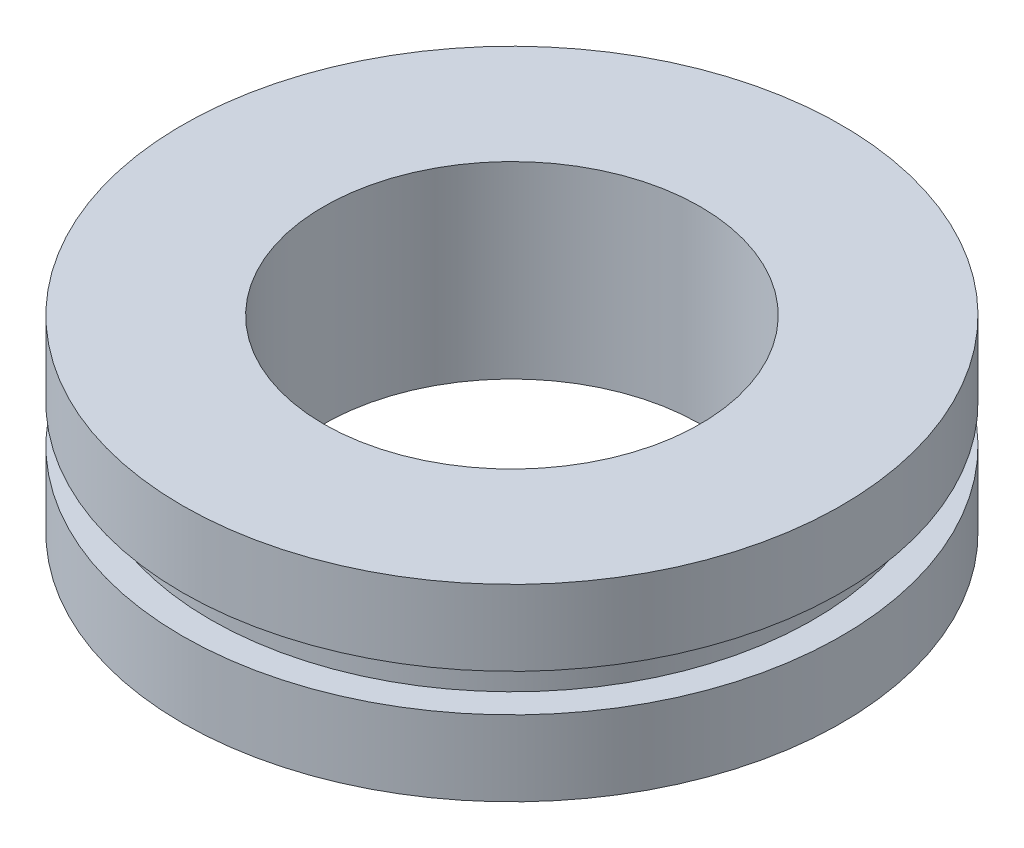
ISO-10303-21;
HEADER;
FILE_DESCRIPTION(('STEP AP214'),'2;1');
FILE_NAME('part.step','',(''),(''),'','','');
FILE_SCHEMA(('AUTOMOTIVE_DESIGN { 1 0 10303 214 1 1 1 1 }'));
ENDSEC;
DATA;
#1=APPLICATION_CONTEXT('core data for automotive mechanical design processes');
#2=APPLICATION_PROTOCOL_DEFINITION('international standard','automotive_design',2000,#1);
#3=PRODUCT_CONTEXT('',#1,'mechanical');
#4=PRODUCT('Part','Part','',(#3));
#5=PRODUCT_RELATED_PRODUCT_CATEGORY('part','',(#4));
#6=PRODUCT_DEFINITION_FORMATION('','',#4);
#7=PRODUCT_DEFINITION_CONTEXT('part definition',#1,'design');
#8=PRODUCT_DEFINITION('design','',#6,#7);
#9=PRODUCT_DEFINITION_SHAPE('','',#8);
#10=(LENGTH_UNIT() NAMED_UNIT(*) SI_UNIT(.MILLI.,.METRE.));
#11=(NAMED_UNIT(*) PLANE_ANGLE_UNIT() SI_UNIT($,.RADIAN.));
#12=(NAMED_UNIT(*) SI_UNIT($,.STERADIAN.) SOLID_ANGLE_UNIT());
#13=UNCERTAINTY_MEASURE_WITH_UNIT(LENGTH_MEASURE(1.E-05),#10,'distance_accuracy_value','');
#14=(GEOMETRIC_REPRESENTATION_CONTEXT(3) GLOBAL_UNCERTAINTY_ASSIGNED_CONTEXT((#13)) GLOBAL_UNIT_ASSIGNED_CONTEXT((#10,
#11,#12)) REPRESENTATION_CONTEXT('',''));
#15=CARTESIAN_POINT('',(0.,0.,0.));
#16=DIRECTION('',(0.,0.,1.));
#17=DIRECTION('',(1.,0.,0.));
#18=AXIS2_PLACEMENT_3D('',#15,#16,#17);
#19=CARTESIAN_POINT('',(0.,10.,0.));
#20=DIRECTION('',(0.,-1.,0.));
#21=DIRECTION('',(0.,0.,-1.));
#22=AXIS2_PLACEMENT_3D('',#19,#20,#21);
#23=CYLINDRICAL_SURFACE('',#22,17.5);
#24=CARTESIAN_POINT('',(0.,0.,0.));
#25=DIRECTION('',(0.,1.,0.));
#26=DIRECTION('',(0.,0.,1.));
#27=AXIS2_PLACEMENT_3D('',#24,#25,#26);
#28=CIRCLE('',#27,17.5);
#29=CARTESIAN_POINT('',(0.,0.,17.5));
#30=VERTEX_POINT('',#29);
#31=EDGE_CURVE('E43',#30,#30,#28,.T.);
#32=ORIENTED_EDGE('',*,*,#31,.T.);
#33=EDGE_LOOP('',(#32));
#34=FACE_BOUND('',#33,.T.);
#35=CARTESIAN_POINT('',(0.,4.,0.));
#36=DIRECTION('',(0.,1.,0.));
#37=DIRECTION('',(0.,0.,1.));
#38=AXIS2_PLACEMENT_3D('',#35,#36,#37);
#39=CIRCLE('',#38,17.5);
#40=CARTESIAN_POINT('',(0.,4.,17.5));
#41=VERTEX_POINT('',#40);
#42=EDGE_CURVE('E55',#41,#41,#39,.T.);
#43=ORIENTED_EDGE('',*,*,#42,.F.);
#44=EDGE_LOOP('',(#43));
#45=FACE_BOUND('',#44,.T.);
#46=ADVANCED_FACE('F39',(#34,#45),#23,.T.);
#47=CARTESIAN_POINT('',(0.,10.,0.));
#48=DIRECTION('',(0.,1.,0.));
#49=DIRECTION('',(0.,0.,1.));
#50=AXIS2_PLACEMENT_3D('',#47,#48,#49);
#51=PLANE('',#50);
#52=CARTESIAN_POINT('',(0.,10.,0.));
#53=DIRECTION('',(0.,1.,0.));
#54=DIRECTION('',(0.,0.,1.));
#55=AXIS2_PLACEMENT_3D('',#52,#53,#54);
#56=CIRCLE('',#55,17.5);
#57=CARTESIAN_POINT('',(0.,10.,17.5));
#58=VERTEX_POINT('',#57);
#59=EDGE_CURVE('E10',#58,#58,#56,.T.);
#60=ORIENTED_EDGE('',*,*,#59,.T.);
#61=EDGE_LOOP('',(#60));
#62=FACE_BOUND('',#61,.T.);
#63=CARTESIAN_POINT('',(0.,10.,0.));
#64=DIRECTION('',(0.,1.,0.));
#65=DIRECTION('',(0.,0.,1.));
#66=AXIS2_PLACEMENT_3D('',#63,#64,#65);
#67=CIRCLE('',#66,10.);
#68=CARTESIAN_POINT('',(0.,10.,10.));
#69=VERTEX_POINT('',#68);
#70=EDGE_CURVE('E50',#69,#69,#67,.T.);
#71=ORIENTED_EDGE('',*,*,#70,.F.);
#72=EDGE_LOOP('',(#71));
#73=FACE_BOUND('',#72,.T.);
#74=ADVANCED_FACE('F82',(#62,#73),#51,.T.);
#75=CARTESIAN_POINT('',(0.,0.,0.));
#76=DIRECTION('',(0.,1.,0.));
#77=DIRECTION('',(0.,0.,1.));
#78=AXIS2_PLACEMENT_3D('',#75,#76,#77);
#79=PLANE('',#78);
#80=ORIENTED_EDGE('',*,*,#31,.F.);
#81=EDGE_LOOP('',(#80));
#82=FACE_BOUND('',#81,.T.);
#83=CARTESIAN_POINT('',(0.,0.,0.));
#84=DIRECTION('',(0.,1.,0.));
#85=DIRECTION('',(0.,0.,1.));
#86=AXIS2_PLACEMENT_3D('',#83,#84,#85);
#87=CIRCLE('',#86,10.);
#88=CARTESIAN_POINT('',(0.,0.,10.));
#89=VERTEX_POINT('',#88);
#90=EDGE_CURVE('E52',#89,#89,#87,.T.);
#91=ORIENTED_EDGE('',*,*,#90,.T.);
#92=EDGE_LOOP('',(#91));
#93=FACE_BOUND('',#92,.T.);
#94=ADVANCED_FACE('F89',(#82,#93),#79,.F.);
#95=CARTESIAN_POINT('',(0.,6.,0.));
#96=DIRECTION('',(0.,1.,0.));
#97=DIRECTION('',(0.,0.,1.));
#98=AXIS2_PLACEMENT_3D('',#95,#96,#97);
#99=CIRCLE('',#98,17.5);
#100=CARTESIAN_POINT('',(0.,6.,17.5));
#101=VERTEX_POINT('',#100);
#102=EDGE_CURVE('E58',#101,#101,#99,.T.);
#103=ORIENTED_EDGE('',*,*,#102,.T.);
#104=EDGE_LOOP('',(#103));
#105=FACE_BOUND('',#104,.T.);
#106=ORIENTED_EDGE('',*,*,#59,.F.);
#107=EDGE_LOOP('',(#106));
#108=FACE_BOUND('',#107,.T.);
#109=ADVANCED_FACE('F41',(#105,#108),#23,.T.);
#110=CARTESIAN_POINT('',(0.,10.,0.));
#111=DIRECTION('',(0.,-1.,0.));
#112=DIRECTION('',(0.,0.,-1.));
#113=AXIS2_PLACEMENT_3D('',#110,#111,#112);
#114=CYLINDRICAL_SURFACE('',#113,10.);
#115=ORIENTED_EDGE('',*,*,#70,.T.);
#116=EDGE_LOOP('',(#115));
#117=FACE_BOUND('',#116,.T.);
#118=ORIENTED_EDGE('',*,*,#90,.F.);
#119=EDGE_LOOP('',(#118));
#120=FACE_BOUND('',#119,.T.);
#121=ADVANCED_FACE('F77',(#117,#120),#114,.F.);
#122=CARTESIAN_POINT('',(0.,4.,0.));
#123=DIRECTION('',(0.,1.,0.));
#124=DIRECTION('',(0.,0.,1.));
#125=AXIS2_PLACEMENT_3D('',#122,#123,#124);
#126=PLANE('',#125);
#127=CARTESIAN_POINT('',(0.,4.,0.));
#128=DIRECTION('',(0.,1.,0.));
#129=DIRECTION('',(0.,0.,1.));
#130=AXIS2_PLACEMENT_3D('',#127,#128,#129);
#131=CIRCLE('',#130,16.);
#132=CARTESIAN_POINT('',(0.,4.,16.));
#133=VERTEX_POINT('',#132);
#134=EDGE_CURVE('E61',#133,#133,#131,.T.);
#135=ORIENTED_EDGE('',*,*,#134,.F.);
#136=EDGE_LOOP('',(#135));
#137=FACE_BOUND('',#136,.T.);
#138=ORIENTED_EDGE('',*,*,#42,.T.);
#139=EDGE_LOOP('',(#138));
#140=FACE_BOUND('',#139,.T.);
#141=ADVANCED_FACE('F73',(#137,#140),#126,.T.);
#142=CARTESIAN_POINT('',(0.,6.,0.));
#143=DIRECTION('',(0.,1.,0.));
#144=DIRECTION('',(0.,0.,1.));
#145=AXIS2_PLACEMENT_3D('',#142,#143,#144);
#146=PLANE('',#145);
#147=CARTESIAN_POINT('',(0.,6.,0.));
#148=DIRECTION('',(0.,1.,0.));
#149=DIRECTION('',(0.,0.,1.));
#150=AXIS2_PLACEMENT_3D('',#147,#148,#149);
#151=CIRCLE('',#150,16.);
#152=CARTESIAN_POINT('',(0.,6.,16.));
#153=VERTEX_POINT('',#152);
#154=EDGE_CURVE('E64',#153,#153,#151,.T.);
#155=ORIENTED_EDGE('',*,*,#154,.T.);
#156=EDGE_LOOP('',(#155));
#157=FACE_BOUND('',#156,.T.);
#158=ORIENTED_EDGE('',*,*,#102,.F.);
#159=EDGE_LOOP('',(#158));
#160=FACE_BOUND('',#159,.T.);
#161=ADVANCED_FACE('F76',(#157,#160),#146,.F.);
#162=CARTESIAN_POINT('',(0.,4.,0.));
#163=DIRECTION('',(0.,1.,0.));
#164=DIRECTION('',(0.,0.,1.));
#165=AXIS2_PLACEMENT_3D('',#162,#163,#164);
#166=CYLINDRICAL_SURFACE('',#165,16.);
#167=ORIENTED_EDGE('',*,*,#134,.T.);
#168=EDGE_LOOP('',(#167));
#169=FACE_BOUND('',#168,.T.);
#170=ORIENTED_EDGE('',*,*,#154,.F.);
#171=EDGE_LOOP('',(#170));
#172=FACE_BOUND('',#171,.T.);
#173=ADVANCED_FACE('F70',(#169,#172),#166,.T.);
#174=CLOSED_SHELL('',(#46,#74,#94,#109,#121,#141,#161,#173));
#175=MANIFOLD_SOLID_BREP('B2',#174);
#176=ADVANCED_BREP_SHAPE_REPRESENTATION('',(#18,#175),#14);
#177=SHAPE_DEFINITION_REPRESENTATION(#9,#176);
ENDSEC;
END-ISO-10303-21;
